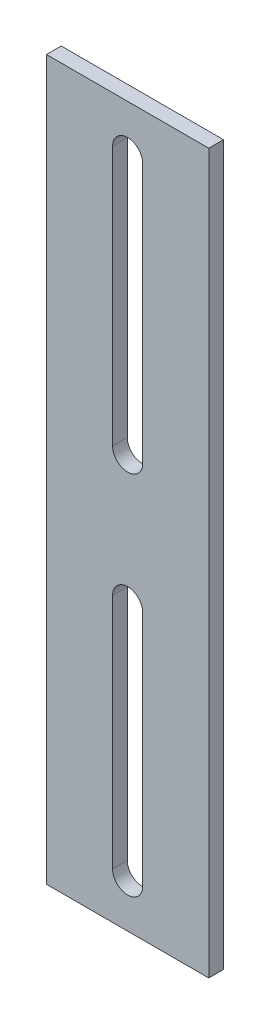
ISO-10303-21;
HEADER;
FILE_DESCRIPTION(('STEP AP214'),'2;1');
FILE_NAME('part.step','',(''),(''),'','','');
FILE_SCHEMA(('AUTOMOTIVE_DESIGN { 1 0 10303 214 1 1 1 1 }'));
ENDSEC;
DATA;
#1=APPLICATION_CONTEXT('core data for automotive mechanical design processes');
#2=APPLICATION_PROTOCOL_DEFINITION('international standard','automotive_design',2000,#1);
#3=PRODUCT_CONTEXT('',#1,'mechanical');
#4=PRODUCT('Part','Part','',(#3));
#5=PRODUCT_RELATED_PRODUCT_CATEGORY('part','',(#4));
#6=PRODUCT_DEFINITION_FORMATION('','',#4);
#7=PRODUCT_DEFINITION_CONTEXT('part definition',#1,'design');
#8=PRODUCT_DEFINITION('design','',#6,#7);
#9=PRODUCT_DEFINITION_SHAPE('','',#8);
#10=(LENGTH_UNIT() NAMED_UNIT(*) SI_UNIT(.MILLI.,.METRE.));
#11=(NAMED_UNIT(*) PLANE_ANGLE_UNIT() SI_UNIT($,.RADIAN.));
#12=(NAMED_UNIT(*) SI_UNIT($,.STERADIAN.) SOLID_ANGLE_UNIT());
#13=UNCERTAINTY_MEASURE_WITH_UNIT(LENGTH_MEASURE(1.E-05),#10,'distance_accuracy_value','');
#14=(GEOMETRIC_REPRESENTATION_CONTEXT(3) GLOBAL_UNCERTAINTY_ASSIGNED_CONTEXT((#13)) GLOBAL_UNIT_ASSIGNED_CONTEXT((#10,
#11,#12)) REPRESENTATION_CONTEXT('',''));
#15=CARTESIAN_POINT('',(0.,0.,0.));
#16=DIRECTION('',(0.,0.,1.));
#17=DIRECTION('',(1.,0.,0.));
#18=AXIS2_PLACEMENT_3D('',#15,#16,#17);
#19=CARTESIAN_POINT('',(0.,0.,6.35));
#20=DIRECTION('',(0.,0.,1.));
#21=DIRECTION('',(1.,0.,0.));
#22=AXIS2_PLACEMENT_3D('',#19,#20,#21);
#23=PLANE('',#22);
#24=DIRECTION('',(0.,-1.,0.));
#25=VECTOR('',#24,1.);
#26=CARTESIAN_POINT('',(-35.,-155.,6.35));
#27=LINE('',#26,#25);
#28=CARTESIAN_POINT('',(-35.,155.,6.35));
#29=VERTEX_POINT('',#28);
#30=CARTESIAN_POINT('',(-35.,-155.,6.35));
#31=VERTEX_POINT('',#30);
#32=EDGE_CURVE('E189',#29,#31,#27,.T.);
#33=ORIENTED_EDGE('',*,*,#32,.T.);
#34=DIRECTION('',(1.,0.,0.));
#35=VECTOR('',#34,1.);
#36=CARTESIAN_POINT('',(35.,-155.,6.35));
#37=LINE('',#36,#35);
#38=CARTESIAN_POINT('',(35.,-155.,6.35));
#39=VERTEX_POINT('',#38);
#40=EDGE_CURVE('E192',#31,#39,#37,.T.);
#41=ORIENTED_EDGE('',*,*,#40,.T.);
#42=DIRECTION('',(0.,1.,0.));
#43=VECTOR('',#42,1.);
#44=CARTESIAN_POINT('',(35.,-155.,6.35));
#45=LINE('',#44,#43);
#46=CARTESIAN_POINT('',(35.,155.,6.35));
#47=VERTEX_POINT('',#46);
#48=EDGE_CURVE('E195',#39,#47,#45,.T.);
#49=ORIENTED_EDGE('',*,*,#48,.T.);
#50=DIRECTION('',(-1.,0.,0.));
#51=VECTOR('',#50,1.);
#52=CARTESIAN_POINT('',(35.,155.,6.35));
#53=LINE('',#52,#51);
#54=EDGE_CURVE('E197',#47,#29,#53,.T.);
#55=ORIENTED_EDGE('',*,*,#54,.T.);
#56=EDGE_LOOP('',(#33,#41,#49,#55));
#57=FACE_BOUND('',#56,.T.);
#58=DIRECTION('',(0.,-1.,0.));
#59=VECTOR('',#58,1.);
#60=CARTESIAN_POINT('',(-6.49999999999999,135.,6.35));
#61=LINE('',#60,#59);
#62=CARTESIAN_POINT('',(-6.49999999999999,135.,6.35));
#63=VERTEX_POINT('',#62);
#64=CARTESIAN_POINT('',(-6.49999999999998,22.997082560351,6.35));
#65=VERTEX_POINT('',#64);
#66=EDGE_CURVE('E160',#63,#65,#61,.T.);
#67=ORIENTED_EDGE('',*,*,#66,.F.);
#68=CARTESIAN_POINT('',(0.,135.,6.35));
#69=DIRECTION('',(0.,0.,1.));
#70=DIRECTION('',(1.,0.,0.));
#71=AXIS2_PLACEMENT_3D('',#68,#69,#70);
#72=CIRCLE('',#71,6.5);
#73=CARTESIAN_POINT('',(6.50000000000001,135.,6.35));
#74=VERTEX_POINT('',#73);
#75=EDGE_CURVE('E158',#74,#63,#72,.T.);
#76=ORIENTED_EDGE('',*,*,#75,.F.);
#77=DIRECTION('',(0.,1.,0.));
#78=VECTOR('',#77,1.);
#79=CARTESIAN_POINT('',(6.50000000000001,135.,6.35));
#80=LINE('',#79,#78);
#81=CARTESIAN_POINT('',(6.50000000000002,22.997082560351,6.35));
#82=VERTEX_POINT('',#81);
#83=EDGE_CURVE('E166',#82,#74,#80,.T.);
#84=ORIENTED_EDGE('',*,*,#83,.F.);
#85=CARTESIAN_POINT('',(0.,22.997082560351,6.35));
#86=DIRECTION('',(0.,0.,1.));
#87=DIRECTION('',(1.,0.,0.));
#88=AXIS2_PLACEMENT_3D('',#85,#86,#87);
#89=CIRCLE('',#88,6.5);
#90=EDGE_CURVE('E163',#65,#82,#89,.T.);
#91=ORIENTED_EDGE('',*,*,#90,.F.);
#92=EDGE_LOOP('',(#67,#76,#84,#91));
#93=FACE_BOUND('',#92,.T.);
#94=DIRECTION('',(0.,1.,0.));
#95=VECTOR('',#94,1.);
#96=CARTESIAN_POINT('',(6.50000000000004,-135.,6.35));
#97=LINE('',#96,#95);
#98=CARTESIAN_POINT('',(6.50000000000004,-135.,6.35));
#99=VERTEX_POINT('',#98);
#100=CARTESIAN_POINT('',(6.50000000000003,-32.8012683971944,6.35));
#101=VERTEX_POINT('',#100);
#102=EDGE_CURVE('E130',#99,#101,#97,.T.);
#103=ORIENTED_EDGE('',*,*,#102,.F.);
#104=CARTESIAN_POINT('',(0.,-135.,6.35));
#105=DIRECTION('',(0.,0.,1.));
#106=DIRECTION('',(1.,0.,0.));
#107=AXIS2_PLACEMENT_3D('',#104,#105,#106);
#108=CIRCLE('',#107,6.5);
#109=CARTESIAN_POINT('',(-6.49999999999996,-135.,6.35));
#110=VERTEX_POINT('',#109);
#111=EDGE_CURVE('E122',#110,#99,#108,.T.);
#112=ORIENTED_EDGE('',*,*,#111,.F.);
#113=DIRECTION('',(0.,-1.,0.));
#114=VECTOR('',#113,1.);
#115=CARTESIAN_POINT('',(-6.49999999999996,-135.,6.35));
#116=LINE('',#115,#114);
#117=CARTESIAN_POINT('',(-6.49999999999998,-32.8012683971944,6.35));
#118=VERTEX_POINT('',#117);
#119=EDGE_CURVE('E144',#118,#110,#116,.T.);
#120=ORIENTED_EDGE('',*,*,#119,.F.);
#121=CARTESIAN_POINT('',(0.,-32.8012683971944,6.35));
#122=DIRECTION('',(0.,0.,1.));
#123=DIRECTION('',(1.,0.,0.));
#124=AXIS2_PLACEMENT_3D('',#121,#122,#123);
#125=CIRCLE('',#124,6.5);
#126=EDGE_CURVE('E142',#101,#118,#125,.T.);
#127=ORIENTED_EDGE('',*,*,#126,.F.);
#128=EDGE_LOOP('',(#103,#112,#120,#127));
#129=FACE_BOUND('',#128,.T.);
#130=ADVANCED_FACE('F33',(#57,#93,#129),#23,.T.);
#131=CARTESIAN_POINT('',(0.,0.,0.));
#132=DIRECTION('',(0.,0.,1.));
#133=DIRECTION('',(1.,0.,0.));
#134=AXIS2_PLACEMENT_3D('',#131,#132,#133);
#135=PLANE('',#134);
#136=CARTESIAN_POINT('',(0.,135.,0.));
#137=DIRECTION('',(0.,0.,1.));
#138=DIRECTION('',(1.,0.,0.));
#139=AXIS2_PLACEMENT_3D('',#136,#137,#138);
#140=CIRCLE('',#139,6.5);
#141=CARTESIAN_POINT('',(6.50000000000001,135.,0.));
#142=VERTEX_POINT('',#141);
#143=CARTESIAN_POINT('',(-6.49999999999999,135.,0.));
#144=VERTEX_POINT('',#143);
#145=EDGE_CURVE('E138',#142,#144,#140,.T.);
#146=ORIENTED_EDGE('',*,*,#145,.T.);
#147=DIRECTION('',(0.,-1.,0.));
#148=VECTOR('',#147,1.);
#149=CARTESIAN_POINT('',(-6.49999999999999,135.,0.));
#150=LINE('',#149,#148);
#151=CARTESIAN_POINT('',(-6.49999999999998,22.997082560351,0.));
#152=VERTEX_POINT('',#151);
#153=EDGE_CURVE('E171',#144,#152,#150,.T.);
#154=ORIENTED_EDGE('',*,*,#153,.T.);
#155=CARTESIAN_POINT('',(0.,22.997082560351,0.));
#156=DIRECTION('',(0.,0.,1.));
#157=DIRECTION('',(1.,0.,0.));
#158=AXIS2_PLACEMENT_3D('',#155,#156,#157);
#159=CIRCLE('',#158,6.5);
#160=CARTESIAN_POINT('',(6.50000000000002,22.997082560351,0.));
#161=VERTEX_POINT('',#160);
#162=EDGE_CURVE('E174',#152,#161,#159,.T.);
#163=ORIENTED_EDGE('',*,*,#162,.T.);
#164=DIRECTION('',(0.,1.,0.));
#165=VECTOR('',#164,1.);
#166=CARTESIAN_POINT('',(6.50000000000001,135.,0.));
#167=LINE('',#166,#165);
#168=EDGE_CURVE('E161',#161,#142,#167,.T.);
#169=ORIENTED_EDGE('',*,*,#168,.T.);
#170=EDGE_LOOP('',(#146,#154,#163,#169));
#171=FACE_BOUND('',#170,.T.);
#172=DIRECTION('',(0.,-1.,0.));
#173=VECTOR('',#172,1.);
#174=CARTESIAN_POINT('',(-35.,-155.,0.));
#175=LINE('',#174,#173);
#176=CARTESIAN_POINT('',(-35.,155.,0.));
#177=VERTEX_POINT('',#176);
#178=CARTESIAN_POINT('',(-35.,-155.,0.));
#179=VERTEX_POINT('',#178);
#180=EDGE_CURVE('E188',#177,#179,#175,.T.);
#181=ORIENTED_EDGE('',*,*,#180,.F.);
#182=DIRECTION('',(-1.,0.,0.));
#183=VECTOR('',#182,1.);
#184=CARTESIAN_POINT('',(35.,155.,0.));
#185=LINE('',#184,#183);
#186=CARTESIAN_POINT('',(35.,155.,0.));
#187=VERTEX_POINT('',#186);
#188=EDGE_CURVE('E193',#187,#177,#185,.T.);
#189=ORIENTED_EDGE('',*,*,#188,.F.);
#190=DIRECTION('',(0.,1.,0.));
#191=VECTOR('',#190,1.);
#192=CARTESIAN_POINT('',(35.,-155.,0.));
#193=LINE('',#192,#191);
#194=CARTESIAN_POINT('',(35.,-155.,0.));
#195=VERTEX_POINT('',#194);
#196=EDGE_CURVE('E204',#195,#187,#193,.T.);
#197=ORIENTED_EDGE('',*,*,#196,.F.);
#198=DIRECTION('',(1.,0.,0.));
#199=VECTOR('',#198,1.);
#200=CARTESIAN_POINT('',(35.,-155.,0.));
#201=LINE('',#200,#199);
#202=EDGE_CURVE('E202',#179,#195,#201,.T.);
#203=ORIENTED_EDGE('',*,*,#202,.F.);
#204=EDGE_LOOP('',(#181,#189,#197,#203));
#205=FACE_BOUND('',#204,.T.);
#206=CARTESIAN_POINT('',(0.,-135.,0.));
#207=DIRECTION('',(0.,0.,1.));
#208=DIRECTION('',(1.,0.,0.));
#209=AXIS2_PLACEMENT_3D('',#206,#207,#208);
#210=CIRCLE('',#209,6.5);
#211=CARTESIAN_POINT('',(-6.49999999999996,-135.,0.));
#212=VERTEX_POINT('',#211);
#213=CARTESIAN_POINT('',(6.50000000000004,-135.,0.));
#214=VERTEX_POINT('',#213);
#215=EDGE_CURVE('E56',#212,#214,#210,.T.);
#216=ORIENTED_EDGE('',*,*,#215,.T.);
#217=DIRECTION('',(0.,1.,0.));
#218=VECTOR('',#217,1.);
#219=CARTESIAN_POINT('',(6.50000000000004,-135.,0.));
#220=LINE('',#219,#218);
#221=CARTESIAN_POINT('',(6.50000000000003,-32.8012683971944,0.));
#222=VERTEX_POINT('',#221);
#223=EDGE_CURVE('E137',#214,#222,#220,.T.);
#224=ORIENTED_EDGE('',*,*,#223,.T.);
#225=CARTESIAN_POINT('',(0.,-32.8012683971944,0.));
#226=DIRECTION('',(0.,0.,1.));
#227=DIRECTION('',(1.,0.,0.));
#228=AXIS2_PLACEMENT_3D('',#225,#226,#227);
#229=CIRCLE('',#228,6.5);
#230=CARTESIAN_POINT('',(-6.49999999999998,-32.8012683971944,0.));
#231=VERTEX_POINT('',#230);
#232=EDGE_CURVE('E150',#222,#231,#229,.T.);
#233=ORIENTED_EDGE('',*,*,#232,.T.);
#234=DIRECTION('',(0.,-1.,0.));
#235=VECTOR('',#234,1.);
#236=CARTESIAN_POINT('',(-6.49999999999996,-135.,0.));
#237=LINE('',#236,#235);
#238=EDGE_CURVE('E131',#231,#212,#237,.T.);
#239=ORIENTED_EDGE('',*,*,#238,.T.);
#240=EDGE_LOOP('',(#216,#224,#233,#239));
#241=FACE_BOUND('',#240,.T.);
#242=ADVANCED_FACE('F222',(#171,#205,#241),#135,.F.);
#243=CARTESIAN_POINT('',(-35.,-155.,6.35));
#244=DIRECTION('',(1.,0.,0.));
#245=DIRECTION('',(0.,1.,0.));
#246=AXIS2_PLACEMENT_3D('',#243,#244,#245);
#247=PLANE('',#246);
#248=ORIENTED_EDGE('',*,*,#180,.T.);
#249=DIRECTION('',(0.,0.,-1.));
#250=VECTOR('',#249,1.);
#251=CARTESIAN_POINT('',(-35.,-155.,6.35));
#252=LINE('',#251,#250);
#253=EDGE_CURVE('E11',#31,#179,#252,.T.);
#254=ORIENTED_EDGE('',*,*,#253,.F.);
#255=ORIENTED_EDGE('',*,*,#32,.F.);
#256=DIRECTION('',(0.,0.,-1.));
#257=VECTOR('',#256,1.);
#258=CARTESIAN_POINT('',(-35.,155.,6.35));
#259=LINE('',#258,#257);
#260=EDGE_CURVE('E199',#29,#177,#259,.T.);
#261=ORIENTED_EDGE('',*,*,#260,.T.);
#262=EDGE_LOOP('',(#248,#254,#255,#261));
#263=FACE_BOUND('',#262,.T.);
#264=ADVANCED_FACE('F35',(#263),#247,.F.);
#265=CARTESIAN_POINT('',(35.,-155.,6.35));
#266=DIRECTION('',(0.,1.,0.));
#267=DIRECTION('',(0.,0.,1.));
#268=AXIS2_PLACEMENT_3D('',#265,#266,#267);
#269=PLANE('',#268);
#270=ORIENTED_EDGE('',*,*,#202,.T.);
#271=DIRECTION('',(0.,0.,-1.));
#272=VECTOR('',#271,1.);
#273=CARTESIAN_POINT('',(35.,-155.,6.35));
#274=LINE('',#273,#272);
#275=EDGE_CURVE('E41',#39,#195,#274,.T.);
#276=ORIENTED_EDGE('',*,*,#275,.F.);
#277=ORIENTED_EDGE('',*,*,#40,.F.);
#278=ORIENTED_EDGE('',*,*,#253,.T.);
#279=EDGE_LOOP('',(#270,#276,#277,#278));
#280=FACE_BOUND('',#279,.T.);
#281=ADVANCED_FACE('F233',(#280),#269,.F.);
#282=CARTESIAN_POINT('',(35.,-155.,6.35));
#283=DIRECTION('',(-1.,0.,0.));
#284=DIRECTION('',(0.,-1.,0.));
#285=AXIS2_PLACEMENT_3D('',#282,#283,#284);
#286=PLANE('',#285);
#287=ORIENTED_EDGE('',*,*,#196,.T.);
#288=DIRECTION('',(0.,0.,-1.));
#289=VECTOR('',#288,1.);
#290=CARTESIAN_POINT('',(35.,155.,6.35));
#291=LINE('',#290,#289);
#292=EDGE_CURVE('E209',#47,#187,#291,.T.);
#293=ORIENTED_EDGE('',*,*,#292,.F.);
#294=ORIENTED_EDGE('',*,*,#48,.F.);
#295=ORIENTED_EDGE('',*,*,#275,.T.);
#296=EDGE_LOOP('',(#287,#293,#294,#295));
#297=FACE_BOUND('',#296,.T.);
#298=ADVANCED_FACE('F216',(#297),#286,.F.);
#299=CARTESIAN_POINT('',(35.,155.,6.35));
#300=DIRECTION('',(0.,-1.,0.));
#301=DIRECTION('',(1.,0.,0.));
#302=AXIS2_PLACEMENT_3D('',#299,#300,#301);
#303=PLANE('',#302);
#304=ORIENTED_EDGE('',*,*,#188,.T.);
#305=ORIENTED_EDGE('',*,*,#260,.F.);
#306=ORIENTED_EDGE('',*,*,#54,.F.);
#307=ORIENTED_EDGE('',*,*,#292,.T.);
#308=EDGE_LOOP('',(#304,#305,#306,#307));
#309=FACE_BOUND('',#308,.T.);
#310=ADVANCED_FACE('F226',(#309),#303,.F.);
#311=CARTESIAN_POINT('',(0.,135.,6.35));
#312=DIRECTION('',(0.,0.,-1.));
#313=DIRECTION('',(-1.,0.,0.));
#314=AXIS2_PLACEMENT_3D('',#311,#312,#313);
#315=CYLINDRICAL_SURFACE('',#314,6.5);
#316=ORIENTED_EDGE('',*,*,#145,.F.);
#317=DIRECTION('',(0.,0.,-1.));
#318=VECTOR('',#317,1.);
#319=CARTESIAN_POINT('',(6.50000000000001,135.,6.35));
#320=LINE('',#319,#318);
#321=EDGE_CURVE('E168',#74,#142,#320,.T.);
#322=ORIENTED_EDGE('',*,*,#321,.F.);
#323=ORIENTED_EDGE('',*,*,#75,.T.);
#324=DIRECTION('',(0.,0.,-1.));
#325=VECTOR('',#324,1.);
#326=CARTESIAN_POINT('',(-6.49999999999999,135.,6.35));
#327=LINE('',#326,#325);
#328=EDGE_CURVE('E185',#63,#144,#327,.T.);
#329=ORIENTED_EDGE('',*,*,#328,.T.);
#330=EDGE_LOOP('',(#316,#322,#323,#329));
#331=FACE_BOUND('',#330,.T.);
#332=ADVANCED_FACE('F248',(#331),#315,.F.);
#333=CARTESIAN_POINT('',(-6.49999999999999,135.,6.35));
#334=DIRECTION('',(1.,0.,0.));
#335=DIRECTION('',(0.,1.,0.));
#336=AXIS2_PLACEMENT_3D('',#333,#334,#335);
#337=PLANE('',#336);
#338=ORIENTED_EDGE('',*,*,#153,.F.);
#339=ORIENTED_EDGE('',*,*,#328,.F.);
#340=ORIENTED_EDGE('',*,*,#66,.T.);
#341=DIRECTION('',(0.,0.,-1.));
#342=VECTOR('',#341,1.);
#343=CARTESIAN_POINT('',(-6.49999999999998,22.997082560351,6.35));
#344=LINE('',#343,#342);
#345=EDGE_CURVE('E183',#65,#152,#344,.T.);
#346=ORIENTED_EDGE('',*,*,#345,.T.);
#347=EDGE_LOOP('',(#338,#339,#340,#346));
#348=FACE_BOUND('',#347,.T.);
#349=ADVANCED_FACE('F255',(#348),#337,.T.);
#350=CARTESIAN_POINT('',(0.,22.997082560351,6.35));
#351=DIRECTION('',(0.,0.,-1.));
#352=DIRECTION('',(-1.,0.,0.));
#353=AXIS2_PLACEMENT_3D('',#350,#351,#352);
#354=CYLINDRICAL_SURFACE('',#353,6.5);
#355=ORIENTED_EDGE('',*,*,#162,.F.);
#356=ORIENTED_EDGE('',*,*,#345,.F.);
#357=ORIENTED_EDGE('',*,*,#90,.T.);
#358=DIRECTION('',(0.,0.,-1.));
#359=VECTOR('',#358,1.);
#360=CARTESIAN_POINT('',(6.50000000000002,22.997082560351,6.35));
#361=LINE('',#360,#359);
#362=EDGE_CURVE('E181',#82,#161,#361,.T.);
#363=ORIENTED_EDGE('',*,*,#362,.T.);
#364=EDGE_LOOP('',(#355,#356,#357,#363));
#365=FACE_BOUND('',#364,.T.);
#366=ADVANCED_FACE('F260',(#365),#354,.F.);
#367=CARTESIAN_POINT('',(6.50000000000001,135.,6.35));
#368=DIRECTION('',(-1.,0.,0.));
#369=DIRECTION('',(0.,-1.,0.));
#370=AXIS2_PLACEMENT_3D('',#367,#368,#369);
#371=PLANE('',#370);
#372=ORIENTED_EDGE('',*,*,#168,.F.);
#373=ORIENTED_EDGE('',*,*,#362,.F.);
#374=ORIENTED_EDGE('',*,*,#83,.T.);
#375=ORIENTED_EDGE('',*,*,#321,.T.);
#376=EDGE_LOOP('',(#372,#373,#374,#375));
#377=FACE_BOUND('',#376,.T.);
#378=ADVANCED_FACE('F267',(#377),#371,.T.);
#379=CARTESIAN_POINT('',(0.,-135.,6.35));
#380=DIRECTION('',(0.,0.,-1.));
#381=DIRECTION('',(-1.,0.,0.));
#382=AXIS2_PLACEMENT_3D('',#379,#380,#381);
#383=CYLINDRICAL_SURFACE('',#382,6.5);
#384=ORIENTED_EDGE('',*,*,#215,.F.);
#385=DIRECTION('',(0.,0.,-1.));
#386=VECTOR('',#385,1.);
#387=CARTESIAN_POINT('',(-6.49999999999996,-135.,6.35));
#388=LINE('',#387,#386);
#389=EDGE_CURVE('E126',#110,#212,#388,.T.);
#390=ORIENTED_EDGE('',*,*,#389,.F.);
#391=ORIENTED_EDGE('',*,*,#111,.T.);
#392=DIRECTION('',(0.,0.,-1.));
#393=VECTOR('',#392,1.);
#394=CARTESIAN_POINT('',(6.50000000000004,-135.,6.35));
#395=LINE('',#394,#393);
#396=EDGE_CURVE('E125',#99,#214,#395,.T.);
#397=ORIENTED_EDGE('',*,*,#396,.T.);
#398=EDGE_LOOP('',(#384,#390,#391,#397));
#399=FACE_BOUND('',#398,.T.);
#400=ADVANCED_FACE('F124',(#399),#383,.F.);
#401=CARTESIAN_POINT('',(6.50000000000004,-135.,6.35));
#402=DIRECTION('',(-1.,0.,0.));
#403=DIRECTION('',(0.,-1.,0.));
#404=AXIS2_PLACEMENT_3D('',#401,#402,#403);
#405=PLANE('',#404);
#406=ORIENTED_EDGE('',*,*,#223,.F.);
#407=ORIENTED_EDGE('',*,*,#396,.F.);
#408=ORIENTED_EDGE('',*,*,#102,.T.);
#409=DIRECTION('',(0.,0.,-1.));
#410=VECTOR('',#409,1.);
#411=CARTESIAN_POINT('',(6.50000000000003,-32.8012683971944,6.35));
#412=LINE('',#411,#410);
#413=EDGE_CURVE('E139',#101,#222,#412,.T.);
#414=ORIENTED_EDGE('',*,*,#413,.T.);
#415=EDGE_LOOP('',(#406,#407,#408,#414));
#416=FACE_BOUND('',#415,.T.);
#417=ADVANCED_FACE('F134',(#416),#405,.T.);
#418=CARTESIAN_POINT('',(0.,-32.8012683971944,6.35));
#419=DIRECTION('',(0.,0.,-1.));
#420=DIRECTION('',(-1.,0.,0.));
#421=AXIS2_PLACEMENT_3D('',#418,#419,#420);
#422=CYLINDRICAL_SURFACE('',#421,6.5);
#423=ORIENTED_EDGE('',*,*,#232,.F.);
#424=ORIENTED_EDGE('',*,*,#413,.F.);
#425=ORIENTED_EDGE('',*,*,#126,.T.);
#426=DIRECTION('',(0.,0.,-1.));
#427=VECTOR('',#426,1.);
#428=CARTESIAN_POINT('',(-6.49999999999998,-32.8012683971944,6.35));
#429=LINE('',#428,#427);
#430=EDGE_CURVE('E48',#118,#231,#429,.T.);
#431=ORIENTED_EDGE('',*,*,#430,.T.);
#432=EDGE_LOOP('',(#423,#424,#425,#431));
#433=FACE_BOUND('',#432,.T.);
#434=ADVANCED_FACE('F285',(#433),#422,.F.);
#435=CARTESIAN_POINT('',(-6.49999999999996,-135.,6.35));
#436=DIRECTION('',(1.,0.,0.));
#437=DIRECTION('',(0.,1.,0.));
#438=AXIS2_PLACEMENT_3D('',#435,#436,#437);
#439=PLANE('',#438);
#440=ORIENTED_EDGE('',*,*,#238,.F.);
#441=ORIENTED_EDGE('',*,*,#430,.F.);
#442=ORIENTED_EDGE('',*,*,#119,.T.);
#443=ORIENTED_EDGE('',*,*,#389,.T.);
#444=EDGE_LOOP('',(#440,#441,#442,#443));
#445=FACE_BOUND('',#444,.T.);
#446=ADVANCED_FACE('F288',(#445),#439,.T.);
#447=CLOSED_SHELL('',(#130,#242,#264,#281,#298,#310,#332,#349,#366,#378,#400,#417,#434,#446));
#448=MANIFOLD_SOLID_BREP('B2',#447);
#449=ADVANCED_BREP_SHAPE_REPRESENTATION('',(#18,#448),#14);
#450=SHAPE_DEFINITION_REPRESENTATION(#9,#449);
ENDSEC;
END-ISO-10303-21;
